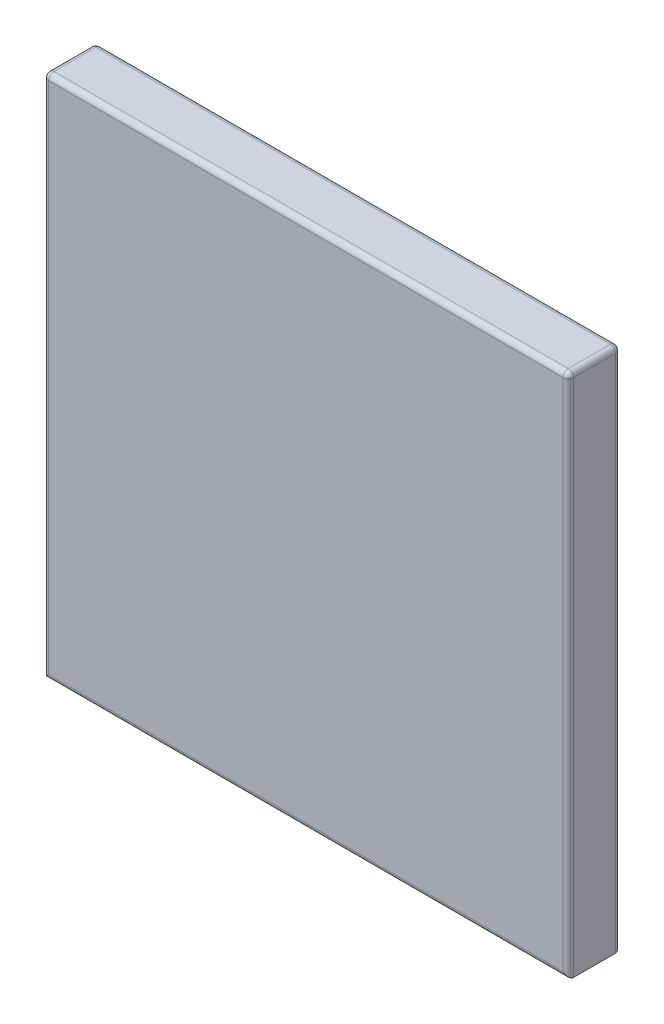
ISO-10303-21;
HEADER;
FILE_DESCRIPTION(('STEP AP214'),'2;1');
FILE_NAME('part.step','',(''),(''),'','','');
FILE_SCHEMA(('AUTOMOTIVE_DESIGN { 1 0 10303 214 1 1 1 1 }'));
ENDSEC;
DATA;
#1=APPLICATION_CONTEXT('core data for automotive mechanical design processes');
#2=APPLICATION_PROTOCOL_DEFINITION('international standard','automotive_design',2000,#1);
#3=PRODUCT_CONTEXT('',#1,'mechanical');
#4=PRODUCT('Part','Part','',(#3));
#5=PRODUCT_RELATED_PRODUCT_CATEGORY('part','',(#4));
#6=PRODUCT_DEFINITION_FORMATION('','',#4);
#7=PRODUCT_DEFINITION_CONTEXT('part definition',#1,'design');
#8=PRODUCT_DEFINITION('design','',#6,#7);
#9=PRODUCT_DEFINITION_SHAPE('','',#8);
#10=(LENGTH_UNIT() NAMED_UNIT(*) SI_UNIT(.MILLI.,.METRE.));
#11=(NAMED_UNIT(*) PLANE_ANGLE_UNIT() SI_UNIT($,.RADIAN.));
#12=(NAMED_UNIT(*) SI_UNIT($,.STERADIAN.) SOLID_ANGLE_UNIT());
#13=UNCERTAINTY_MEASURE_WITH_UNIT(LENGTH_MEASURE(1.E-05),#10,'distance_accuracy_value','');
#14=(GEOMETRIC_REPRESENTATION_CONTEXT(3) GLOBAL_UNCERTAINTY_ASSIGNED_CONTEXT((#13)) GLOBAL_UNIT_ASSIGNED_CONTEXT((#10,
#11,#12)) REPRESENTATION_CONTEXT('',''));
#15=CARTESIAN_POINT('',(0.,0.,0.));
#16=DIRECTION('',(0.,0.,1.));
#17=DIRECTION('',(1.,0.,0.));
#18=AXIS2_PLACEMENT_3D('',#15,#16,#17);
#19=CARTESIAN_POINT('',(50.,50.,10.));
#20=DIRECTION('',(-1.,0.,0.));
#21=DIRECTION('',(0.,-1.,0.));
#22=AXIS2_PLACEMENT_3D('',#19,#20,#21);
#23=PLANE('',#22);
#24=DIRECTION('',(0.,0.,-1.));
#25=VECTOR('',#24,1.);
#26=CARTESIAN_POINT('',(50.,-50.,10.));
#27=LINE('',#26,#25);
#28=CARTESIAN_POINT('',(50.,-50.,9.));
#29=VERTEX_POINT('',#28);
#30=CARTESIAN_POINT('',(50.,-50.,0.999999999999999));
#31=VERTEX_POINT('',#30);
#32=EDGE_CURVE('E163',#29,#31,#27,.T.);
#33=ORIENTED_EDGE('',*,*,#32,.T.);
#34=DIRECTION('',(0.,1.,0.));
#35=VECTOR('',#34,1.);
#36=CARTESIAN_POINT('',(50.,50.,0.999999999999999));
#37=LINE('',#36,#35);
#38=CARTESIAN_POINT('',(50.,49.,0.999999999999999));
#39=VERTEX_POINT('',#38);
#40=EDGE_CURVE('E192',#31,#39,#37,.T.);
#41=ORIENTED_EDGE('',*,*,#40,.T.);
#42=DIRECTION('',(0.,0.,-1.));
#43=VECTOR('',#42,1.);
#44=CARTESIAN_POINT('',(50.,49.,10.));
#45=LINE('',#44,#43);
#46=CARTESIAN_POINT('',(50.,49.,9.));
#47=VERTEX_POINT('',#46);
#48=EDGE_CURVE('E189',#39,#47,#45,.F.);
#49=ORIENTED_EDGE('',*,*,#48,.T.);
#50=DIRECTION('',(0.,1.,0.));
#51=VECTOR('',#50,1.);
#52=CARTESIAN_POINT('',(50.,-50.,9.));
#53=LINE('',#52,#51);
#54=EDGE_CURVE('E187',#47,#29,#53,.F.);
#55=ORIENTED_EDGE('',*,*,#54,.T.);
#56=EDGE_LOOP('',(#33,#41,#49,#55));
#57=FACE_BOUND('',#56,.T.);
#58=ADVANCED_FACE('F35',(#57),#23,.F.);
#59=CARTESIAN_POINT('',(-50.,50.,10.));
#60=DIRECTION('',(0.,-1.,0.));
#61=DIRECTION('',(0.,0.,-1.));
#62=AXIS2_PLACEMENT_3D('',#59,#60,#61);
#63=PLANE('',#62);
#64=DIRECTION('',(-1.,0.,0.));
#65=VECTOR('',#64,1.);
#66=CARTESIAN_POINT('',(50.,50.,9.));
#67=LINE('',#66,#65);
#68=CARTESIAN_POINT('',(-49.,50.,9.));
#69=VERTEX_POINT('',#68);
#70=CARTESIAN_POINT('',(49.,50.,9.));
#71=VERTEX_POINT('',#70);
#72=EDGE_CURVE('E178',#69,#71,#67,.F.);
#73=ORIENTED_EDGE('',*,*,#72,.T.);
#74=DIRECTION('',(0.,0.,-1.));
#75=VECTOR('',#74,1.);
#76=CARTESIAN_POINT('',(49.,50.,10.));
#77=LINE('',#76,#75);
#78=CARTESIAN_POINT('',(49.,50.,0.999999999999999));
#79=VERTEX_POINT('',#78);
#80=EDGE_CURVE('E185',#71,#79,#77,.T.);
#81=ORIENTED_EDGE('',*,*,#80,.T.);
#82=DIRECTION('',(-1.,0.,0.));
#83=VECTOR('',#82,1.);
#84=CARTESIAN_POINT('',(-50.,50.,0.999999999999999));
#85=LINE('',#84,#83);
#86=CARTESIAN_POINT('',(-49.,50.,0.999999999999999));
#87=VERTEX_POINT('',#86);
#88=EDGE_CURVE('E133',#79,#87,#85,.T.);
#89=ORIENTED_EDGE('',*,*,#88,.T.);
#90=DIRECTION('',(0.,0.,-1.));
#91=VECTOR('',#90,1.);
#92=CARTESIAN_POINT('',(-49.,50.,10.));
#93=LINE('',#92,#91);
#94=EDGE_CURVE('E183',#87,#69,#93,.F.);
#95=ORIENTED_EDGE('',*,*,#94,.T.);
#96=EDGE_LOOP('',(#73,#81,#89,#95));
#97=FACE_BOUND('',#96,.T.);
#98=ADVANCED_FACE('F251',(#97),#63,.F.);
#99=CARTESIAN_POINT('',(-50.,50.,10.));
#100=DIRECTION('',(1.,0.,0.));
#101=DIRECTION('',(0.,1.,0.));
#102=AXIS2_PLACEMENT_3D('',#99,#100,#101);
#103=PLANE('',#102);
#104=DIRECTION('',(0.,0.,-1.));
#105=VECTOR('',#104,1.);
#106=CARTESIAN_POINT('',(-50.,49.,10.));
#107=LINE('',#106,#105);
#108=CARTESIAN_POINT('',(-50.,49.,9.));
#109=VERTEX_POINT('',#108);
#110=CARTESIAN_POINT('',(-50.,49.,0.999999999999999));
#111=VERTEX_POINT('',#110);
#112=EDGE_CURVE('E200',#109,#111,#107,.T.);
#113=ORIENTED_EDGE('',*,*,#112,.T.);
#114=DIRECTION('',(0.,-1.,0.));
#115=VECTOR('',#114,1.);
#116=CARTESIAN_POINT('',(-50.,50.,0.999999999999999));
#117=LINE('',#116,#115);
#118=CARTESIAN_POINT('',(-50.,-50.,0.999999999999999));
#119=VERTEX_POINT('',#118);
#120=EDGE_CURVE('E145',#111,#119,#117,.T.);
#121=ORIENTED_EDGE('',*,*,#120,.T.);
#122=DIRECTION('',(0.,0.,-1.));
#123=VECTOR('',#122,1.);
#124=CARTESIAN_POINT('',(-50.,-50.,10.));
#125=LINE('',#124,#123);
#126=CARTESIAN_POINT('',(-50.,-50.,9.));
#127=VERTEX_POINT('',#126);
#128=EDGE_CURVE('E168',#127,#119,#125,.T.);
#129=ORIENTED_EDGE('',*,*,#128,.F.);
#130=DIRECTION('',(0.,-1.,0.));
#131=VECTOR('',#130,1.);
#132=CARTESIAN_POINT('',(-50.,49.,9.));
#133=LINE('',#132,#131);
#134=EDGE_CURVE('E198',#127,#109,#133,.F.);
#135=ORIENTED_EDGE('',*,*,#134,.T.);
#136=EDGE_LOOP('',(#113,#121,#129,#135));
#137=FACE_BOUND('',#136,.T.);
#138=ADVANCED_FACE('F232',(#137),#103,.F.);
#139=CARTESIAN_POINT('',(-50.,-50.,10.));
#140=DIRECTION('',(0.,1.,0.));
#141=DIRECTION('',(0.,0.,1.));
#142=AXIS2_PLACEMENT_3D('',#139,#140,#141);
#143=PLANE('',#142);
#144=ORIENTED_EDGE('',*,*,#128,.T.);
#145=DIRECTION('',(1.,0.,0.));
#146=VECTOR('',#145,1.);
#147=CARTESIAN_POINT('',(-50.,-50.,0.999999999999999));
#148=LINE('',#147,#146);
#149=EDGE_CURVE('E122',#119,#31,#148,.T.);
#150=ORIENTED_EDGE('',*,*,#149,.T.);
#151=ORIENTED_EDGE('',*,*,#32,.F.);
#152=DIRECTION('',(1.,0.,0.));
#153=VECTOR('',#152,1.);
#154=CARTESIAN_POINT('',(-50.,-50.,9.));
#155=LINE('',#154,#153);
#156=EDGE_CURVE('E203',#29,#127,#155,.F.);
#157=ORIENTED_EDGE('',*,*,#156,.T.);
#158=EDGE_LOOP('',(#144,#150,#151,#157));
#159=FACE_BOUND('',#158,.T.);
#160=ADVANCED_FACE('F228',(#159),#143,.F.);
#161=CARTESIAN_POINT('',(0.,0.,10.));
#162=DIRECTION('',(0.,0.,1.));
#163=DIRECTION('',(1.,0.,0.));
#164=AXIS2_PLACEMENT_3D('',#161,#162,#163);
#165=PLANE('',#164);
#166=DIRECTION('',(1.,0.,0.));
#167=VECTOR('',#166,1.);
#168=CARTESIAN_POINT('',(50.,-49.,10.));
#169=LINE('',#168,#167);
#170=CARTESIAN_POINT('',(-49.,-49.,10.));
#171=VERTEX_POINT('',#170);
#172=CARTESIAN_POINT('',(49.,-49.,10.));
#173=VERTEX_POINT('',#172);
#174=EDGE_CURVE('E44',#171,#173,#169,.T.);
#175=ORIENTED_EDGE('',*,*,#174,.T.);
#176=DIRECTION('',(0.,1.,0.));
#177=VECTOR('',#176,1.);
#178=CARTESIAN_POINT('',(49.,49.,10.));
#179=LINE('',#178,#177);
#180=CARTESIAN_POINT('',(49.,49.,10.));
#181=VERTEX_POINT('',#180);
#182=EDGE_CURVE('E11',#173,#181,#179,.T.);
#183=ORIENTED_EDGE('',*,*,#182,.T.);
#184=DIRECTION('',(-1.,0.,0.));
#185=VECTOR('',#184,1.);
#186=CARTESIAN_POINT('',(-50.,49.,10.));
#187=LINE('',#186,#185);
#188=CARTESIAN_POINT('',(-49.,49.,10.));
#189=VERTEX_POINT('',#188);
#190=EDGE_CURVE('E174',#181,#189,#187,.T.);
#191=ORIENTED_EDGE('',*,*,#190,.T.);
#192=DIRECTION('',(0.,-1.,0.));
#193=VECTOR('',#192,1.);
#194=CARTESIAN_POINT('',(-49.,-50.,10.));
#195=LINE('',#194,#193);
#196=EDGE_CURVE('E55',#189,#171,#195,.T.);
#197=ORIENTED_EDGE('',*,*,#196,.T.);
#198=EDGE_LOOP('',(#175,#183,#191,#197));
#199=FACE_BOUND('',#198,.T.);
#200=ADVANCED_FACE('F243',(#199),#165,.T.);
#201=CARTESIAN_POINT('',(0.,0.,0.));
#202=DIRECTION('',(0.,0.,1.));
#203=DIRECTION('',(1.,0.,0.));
#204=AXIS2_PLACEMENT_3D('',#201,#202,#203);
#205=PLANE('',#204);
#206=DIRECTION('',(-1.,0.,0.));
#207=VECTOR('',#206,1.);
#208=CARTESIAN_POINT('',(0.,49.,0.));
#209=LINE('',#208,#207);
#210=CARTESIAN_POINT('',(-49.,49.,0.));
#211=VERTEX_POINT('',#210);
#212=CARTESIAN_POINT('',(49.,49.,0.));
#213=VERTEX_POINT('',#212);
#214=EDGE_CURVE('E115',#211,#213,#209,.F.);
#215=ORIENTED_EDGE('',*,*,#214,.T.);
#216=DIRECTION('',(0.,1.,0.));
#217=VECTOR('',#216,1.);
#218=CARTESIAN_POINT('',(49.,0.,0.));
#219=LINE('',#218,#217);
#220=CARTESIAN_POINT('',(49.,-49.,0.));
#221=VERTEX_POINT('',#220);
#222=EDGE_CURVE('E207',#213,#221,#219,.F.);
#223=ORIENTED_EDGE('',*,*,#222,.T.);
#224=DIRECTION('',(1.,0.,0.));
#225=VECTOR('',#224,1.);
#226=CARTESIAN_POINT('',(0.,-49.,0.));
#227=LINE('',#226,#225);
#228=CARTESIAN_POINT('',(-49.,-49.,0.));
#229=VERTEX_POINT('',#228);
#230=EDGE_CURVE('E117',#221,#229,#227,.F.);
#231=ORIENTED_EDGE('',*,*,#230,.T.);
#232=DIRECTION('',(0.,-1.,0.));
#233=VECTOR('',#232,1.);
#234=CARTESIAN_POINT('',(-49.,0.,0.));
#235=LINE('',#234,#233);
#236=EDGE_CURVE('E112',#229,#211,#235,.F.);
#237=ORIENTED_EDGE('',*,*,#236,.T.);
#238=EDGE_LOOP('',(#215,#223,#231,#237));
#239=FACE_BOUND('',#238,.T.);
#240=ADVANCED_FACE('F114',(#239),#205,.F.);
#241=CARTESIAN_POINT('',(0.,49.,9.));
#242=DIRECTION('',(1.,0.,0.));
#243=DIRECTION('',(0.,0.,-1.));
#244=AXIS2_PLACEMENT_3D('',#241,#242,#243);
#245=CYLINDRICAL_SURFACE('',#244,1.);
#246=ORIENTED_EDGE('',*,*,#190,.F.);
#247=CARTESIAN_POINT('',(49.,49.,9.));
#248=DIRECTION('',(1.,0.,0.));
#249=DIRECTION('',(0.,0.,-1.));
#250=AXIS2_PLACEMENT_3D('',#247,#248,#249);
#251=CIRCLE('',#250,1.);
#252=EDGE_CURVE('E196',#181,#71,#251,.F.);
#253=ORIENTED_EDGE('',*,*,#252,.T.);
#254=ORIENTED_EDGE('',*,*,#72,.F.);
#255=CARTESIAN_POINT('',(-49.,49.,9.));
#256=DIRECTION('',(1.,0.,0.));
#257=DIRECTION('',(0.,0.,-1.));
#258=AXIS2_PLACEMENT_3D('',#255,#256,#257);
#259=CIRCLE('',#258,1.);
#260=EDGE_CURVE('E194',#69,#189,#259,.T.);
#261=ORIENTED_EDGE('',*,*,#260,.T.);
#262=EDGE_LOOP('',(#246,#253,#254,#261));
#263=FACE_BOUND('',#262,.T.);
#264=ADVANCED_FACE('F245',(#263),#245,.T.);
#265=CARTESIAN_POINT('',(-50.,49.,0.999999999999999));
#266=DIRECTION('',(-1.,0.,0.));
#267=DIRECTION('',(0.,0.,1.));
#268=AXIS2_PLACEMENT_3D('',#265,#266,#267);
#269=CYLINDRICAL_SURFACE('',#268,1.);
#270=ORIENTED_EDGE('',*,*,#88,.F.);
#271=CARTESIAN_POINT('',(49.,49.,0.999999999999999));
#272=DIRECTION('',(-1.,0.,0.));
#273=DIRECTION('',(0.,0.,1.));
#274=AXIS2_PLACEMENT_3D('',#271,#272,#273);
#275=CIRCLE('',#274,1.);
#276=EDGE_CURVE('E132',#79,#213,#275,.T.);
#277=ORIENTED_EDGE('',*,*,#276,.T.);
#278=ORIENTED_EDGE('',*,*,#214,.F.);
#279=CARTESIAN_POINT('',(-49.,49.,0.999999999999999));
#280=DIRECTION('',(-1.,0.,0.));
#281=DIRECTION('',(0.,0.,1.));
#282=AXIS2_PLACEMENT_3D('',#279,#280,#281);
#283=CIRCLE('',#282,1.);
#284=EDGE_CURVE('E129',#211,#87,#283,.F.);
#285=ORIENTED_EDGE('',*,*,#284,.T.);
#286=EDGE_LOOP('',(#270,#277,#278,#285));
#287=FACE_BOUND('',#286,.T.);
#288=ADVANCED_FACE('F128',(#287),#269,.T.);
#289=CARTESIAN_POINT('',(-49.,49.,9.));
#290=DIRECTION('',(1.,0.,0.));
#291=DIRECTION('',(0.,1.,0.));
#292=AXIS2_PLACEMENT_3D('',#289,#290,#291);
#293=SPHERICAL_SURFACE('',#292,1.);
#294=CARTESIAN_POINT('',(-49.,49.,9.));
#295=DIRECTION('',(0.,-1.,0.));
#296=DIRECTION('',(0.,0.,-1.));
#297=AXIS2_PLACEMENT_3D('',#294,#295,#296);
#298=CIRCLE('',#297,1.);
#299=EDGE_CURVE('E156',#189,#109,#298,.T.);
#300=ORIENTED_EDGE('',*,*,#299,.F.);
#301=ORIENTED_EDGE('',*,*,#260,.F.);
#302=CARTESIAN_POINT('',(-49.,49.,9.));
#303=DIRECTION('',(0.,0.,-1.));
#304=DIRECTION('',(-1.,0.,0.));
#305=AXIS2_PLACEMENT_3D('',#302,#303,#304);
#306=CIRCLE('',#305,1.);
#307=EDGE_CURVE('E39',#109,#69,#306,.T.);
#308=ORIENTED_EDGE('',*,*,#307,.F.);
#309=EDGE_LOOP('',(#300,#301,#308));
#310=FACE_BOUND('',#309,.T.);
#311=ADVANCED_FACE('F37',(#310),#293,.T.);
#312=CARTESIAN_POINT('',(-49.,49.,10.));
#313=DIRECTION('',(0.,0.,-1.));
#314=DIRECTION('',(-1.,0.,0.));
#315=AXIS2_PLACEMENT_3D('',#312,#313,#314);
#316=CYLINDRICAL_SURFACE('',#315,1.);
#317=ORIENTED_EDGE('',*,*,#307,.T.);
#318=ORIENTED_EDGE('',*,*,#94,.F.);
#319=CARTESIAN_POINT('',(-49.,49.,0.999999999999999));
#320=DIRECTION('',(0.,0.,-1.));
#321=DIRECTION('',(-1.,0.,0.));
#322=AXIS2_PLACEMENT_3D('',#319,#320,#321);
#323=CIRCLE('',#322,1.);
#324=EDGE_CURVE('E142',#111,#87,#323,.T.);
#325=ORIENTED_EDGE('',*,*,#324,.F.);
#326=ORIENTED_EDGE('',*,*,#112,.F.);
#327=EDGE_LOOP('',(#317,#318,#325,#326));
#328=FACE_BOUND('',#327,.T.);
#329=ADVANCED_FACE('F249',(#328),#316,.T.);
#330=CARTESIAN_POINT('',(-49.,0.,9.));
#331=DIRECTION('',(0.,1.,0.));
#332=DIRECTION('',(-1.,0.,0.));
#333=AXIS2_PLACEMENT_3D('',#330,#331,#332);
#334=CYLINDRICAL_SURFACE('',#333,1.);
#335=ORIENTED_EDGE('',*,*,#299,.T.);
#336=ORIENTED_EDGE('',*,*,#134,.F.);
#337=CARTESIAN_POINT('',(-49.,-49.,9.));
#338=DIRECTION('',(-0.707106781186548,0.707106781186547,0.));
#339=DIRECTION('',(0.707106781186547,0.707106781186548,0.));
#340=AXIS2_PLACEMENT_3D('',#337,#338,#339);
#341=ELLIPSE('',#340,1.41421356237309,1.);
#342=EDGE_CURVE('E146',#171,#127,#341,.F.);
#343=ORIENTED_EDGE('',*,*,#342,.F.);
#344=ORIENTED_EDGE('',*,*,#196,.F.);
#345=EDGE_LOOP('',(#335,#336,#343,#344));
#346=FACE_BOUND('',#345,.T.);
#347=ADVANCED_FACE('F233',(#346),#334,.T.);
#348=CARTESIAN_POINT('',(-49.,49.,0.999999999999999));
#349=DIRECTION('',(1.,0.,0.));
#350=DIRECTION('',(0.,1.,0.));
#351=AXIS2_PLACEMENT_3D('',#348,#349,#350);
#352=SPHERICAL_SURFACE('',#351,1.);
#353=ORIENTED_EDGE('',*,*,#324,.T.);
#354=ORIENTED_EDGE('',*,*,#284,.F.);
#355=CARTESIAN_POINT('',(-49.,49.,0.999999999999999));
#356=DIRECTION('',(0.,-1.,0.));
#357=DIRECTION('',(0.,0.,-1.));
#358=AXIS2_PLACEMENT_3D('',#355,#356,#357);
#359=CIRCLE('',#358,1.);
#360=EDGE_CURVE('E139',#111,#211,#359,.T.);
#361=ORIENTED_EDGE('',*,*,#360,.F.);
#362=EDGE_LOOP('',(#353,#354,#361));
#363=FACE_BOUND('',#362,.T.);
#364=ADVANCED_FACE('F138',(#363),#352,.T.);
#365=CARTESIAN_POINT('',(0.,-49.,9.));
#366=DIRECTION('',(-1.,0.,0.));
#367=DIRECTION('',(0.,0.,1.));
#368=AXIS2_PLACEMENT_3D('',#365,#366,#367);
#369=CYLINDRICAL_SURFACE('',#368,1.);
#370=ORIENTED_EDGE('',*,*,#342,.T.);
#371=ORIENTED_EDGE('',*,*,#156,.F.);
#372=CARTESIAN_POINT('',(49.,-49.,9.));
#373=DIRECTION('',(-0.707106781186547,-0.707106781186548,0.));
#374=DIRECTION('',(-0.707106781186548,0.707106781186547,0.));
#375=AXIS2_PLACEMENT_3D('',#372,#373,#374);
#376=ELLIPSE('',#375,1.4142135623731,1.);
#377=EDGE_CURVE('E147',#173,#29,#376,.F.);
#378=ORIENTED_EDGE('',*,*,#377,.F.);
#379=ORIENTED_EDGE('',*,*,#174,.F.);
#380=EDGE_LOOP('',(#370,#371,#378,#379));
#381=FACE_BOUND('',#380,.T.);
#382=ADVANCED_FACE('F235',(#381),#369,.T.);
#383=CARTESIAN_POINT('',(-49.,50.,0.999999999999999));
#384=DIRECTION('',(0.,-1.,0.));
#385=DIRECTION('',(1.,0.,0.));
#386=AXIS2_PLACEMENT_3D('',#383,#384,#385);
#387=CYLINDRICAL_SURFACE('',#386,1.);
#388=ORIENTED_EDGE('',*,*,#360,.T.);
#389=ORIENTED_EDGE('',*,*,#236,.F.);
#390=CARTESIAN_POINT('',(-49.,-49.,0.999999999999999));
#391=DIRECTION('',(0.707106781186548,-0.707106781186547,0.));
#392=DIRECTION('',(-0.707106781186547,-0.707106781186548,0.));
#393=AXIS2_PLACEMENT_3D('',#390,#391,#392);
#394=ELLIPSE('',#393,1.41421356237309,1.);
#395=EDGE_CURVE('E152',#119,#229,#394,.T.);
#396=ORIENTED_EDGE('',*,*,#395,.F.);
#397=ORIENTED_EDGE('',*,*,#120,.F.);
#398=EDGE_LOOP('',(#388,#389,#396,#397));
#399=FACE_BOUND('',#398,.T.);
#400=ADVANCED_FACE('F144',(#399),#387,.T.);
#401=CARTESIAN_POINT('',(49.,0.,9.));
#402=DIRECTION('',(0.,-1.,0.));
#403=DIRECTION('',(1.,0.,0.));
#404=AXIS2_PLACEMENT_3D('',#401,#402,#403);
#405=CYLINDRICAL_SURFACE('',#404,1.);
#406=ORIENTED_EDGE('',*,*,#377,.T.);
#407=ORIENTED_EDGE('',*,*,#54,.F.);
#408=CARTESIAN_POINT('',(49.,49.,9.));
#409=DIRECTION('',(0.,1.,0.));
#410=DIRECTION('',(0.,0.,1.));
#411=AXIS2_PLACEMENT_3D('',#408,#409,#410);
#412=CIRCLE('',#411,1.);
#413=EDGE_CURVE('E221',#181,#47,#412,.T.);
#414=ORIENTED_EDGE('',*,*,#413,.F.);
#415=ORIENTED_EDGE('',*,*,#182,.F.);
#416=EDGE_LOOP('',(#406,#407,#414,#415));
#417=FACE_BOUND('',#416,.T.);
#418=ADVANCED_FACE('F240',(#417),#405,.T.);
#419=CARTESIAN_POINT('',(-50.,-49.,0.999999999999999));
#420=DIRECTION('',(1.,0.,0.));
#421=DIRECTION('',(0.,0.,-1.));
#422=AXIS2_PLACEMENT_3D('',#419,#420,#421);
#423=CYLINDRICAL_SURFACE('',#422,1.);
#424=ORIENTED_EDGE('',*,*,#395,.T.);
#425=ORIENTED_EDGE('',*,*,#230,.F.);
#426=CARTESIAN_POINT('',(49.,-49.,0.999999999999999));
#427=DIRECTION('',(0.707106781186547,0.707106781186548,0.));
#428=DIRECTION('',(-0.707106781186548,0.707106781186547,0.));
#429=AXIS2_PLACEMENT_3D('',#426,#427,#428);
#430=ELLIPSE('',#429,1.4142135623731,1.);
#431=EDGE_CURVE('E218',#31,#221,#430,.T.);
#432=ORIENTED_EDGE('',*,*,#431,.F.);
#433=ORIENTED_EDGE('',*,*,#149,.F.);
#434=EDGE_LOOP('',(#424,#425,#432,#433));
#435=FACE_BOUND('',#434,.T.);
#436=ADVANCED_FACE('F225',(#435),#423,.T.);
#437=CARTESIAN_POINT('',(49.,49.,9.));
#438=DIRECTION('',(-1.,0.,0.));
#439=DIRECTION('',(0.,-1.,0.));
#440=AXIS2_PLACEMENT_3D('',#437,#438,#439);
#441=SPHERICAL_SURFACE('',#440,1.);
#442=ORIENTED_EDGE('',*,*,#252,.F.);
#443=ORIENTED_EDGE('',*,*,#413,.T.);
#444=CARTESIAN_POINT('',(49.,49.,9.));
#445=DIRECTION('',(0.,0.,-1.));
#446=DIRECTION('',(-1.,0.,0.));
#447=AXIS2_PLACEMENT_3D('',#444,#445,#446);
#448=CIRCLE('',#447,1.);
#449=EDGE_CURVE('E216',#71,#47,#448,.T.);
#450=ORIENTED_EDGE('',*,*,#449,.F.);
#451=EDGE_LOOP('',(#442,#443,#450));
#452=FACE_BOUND('',#451,.T.);
#453=ADVANCED_FACE('F282',(#452),#441,.T.);
#454=CARTESIAN_POINT('',(49.,50.,0.999999999999999));
#455=DIRECTION('',(0.,1.,0.));
#456=DIRECTION('',(-1.,0.,0.));
#457=AXIS2_PLACEMENT_3D('',#454,#455,#456);
#458=CYLINDRICAL_SURFACE('',#457,1.);
#459=ORIENTED_EDGE('',*,*,#431,.T.);
#460=ORIENTED_EDGE('',*,*,#222,.F.);
#461=CARTESIAN_POINT('',(49.,49.,0.999999999999999));
#462=DIRECTION('',(0.,1.,0.));
#463=DIRECTION('',(0.,0.,1.));
#464=AXIS2_PLACEMENT_3D('',#461,#462,#463);
#465=CIRCLE('',#464,1.);
#466=EDGE_CURVE('E214',#39,#213,#465,.T.);
#467=ORIENTED_EDGE('',*,*,#466,.F.);
#468=ORIENTED_EDGE('',*,*,#40,.F.);
#469=EDGE_LOOP('',(#459,#460,#467,#468));
#470=FACE_BOUND('',#469,.T.);
#471=ADVANCED_FACE('F263',(#470),#458,.T.);
#472=CARTESIAN_POINT('',(49.,49.,10.));
#473=DIRECTION('',(0.,0.,-1.));
#474=DIRECTION('',(-1.,0.,0.));
#475=AXIS2_PLACEMENT_3D('',#472,#473,#474);
#476=CYLINDRICAL_SURFACE('',#475,1.);
#477=ORIENTED_EDGE('',*,*,#449,.T.);
#478=ORIENTED_EDGE('',*,*,#48,.F.);
#479=CARTESIAN_POINT('',(49.,49.,0.999999999999999));
#480=DIRECTION('',(0.,0.,-1.));
#481=DIRECTION('',(-1.,0.,0.));
#482=AXIS2_PLACEMENT_3D('',#479,#480,#481);
#483=CIRCLE('',#482,1.);
#484=EDGE_CURVE('E211',#79,#39,#483,.T.);
#485=ORIENTED_EDGE('',*,*,#484,.F.);
#486=ORIENTED_EDGE('',*,*,#80,.F.);
#487=EDGE_LOOP('',(#477,#478,#485,#486));
#488=FACE_BOUND('',#487,.T.);
#489=ADVANCED_FACE('F261',(#488),#476,.T.);
#490=CARTESIAN_POINT('',(49.,49.,0.999999999999999));
#491=DIRECTION('',(-1.,0.,0.));
#492=DIRECTION('',(0.,-1.,0.));
#493=AXIS2_PLACEMENT_3D('',#490,#491,#492);
#494=SPHERICAL_SURFACE('',#493,1.);
#495=ORIENTED_EDGE('',*,*,#466,.T.);
#496=ORIENTED_EDGE('',*,*,#276,.F.);
#497=ORIENTED_EDGE('',*,*,#484,.T.);
#498=EDGE_LOOP('',(#495,#496,#497));
#499=FACE_BOUND('',#498,.T.);
#500=ADVANCED_FACE('F256',(#499),#494,.T.);
#501=CLOSED_SHELL('',(#58,#98,#138,#160,#200,#240,#264,#288,#311,#329,#347,#364,#382,#400,#418,
#436,#453,#471,#489,#500));
#502=MANIFOLD_SOLID_BREP('B2',#501);
#503=ADVANCED_BREP_SHAPE_REPRESENTATION('',(#18,#502),#14);
#504=SHAPE_DEFINITION_REPRESENTATION(#9,#503);
ENDSEC;
END-ISO-10303-21;
